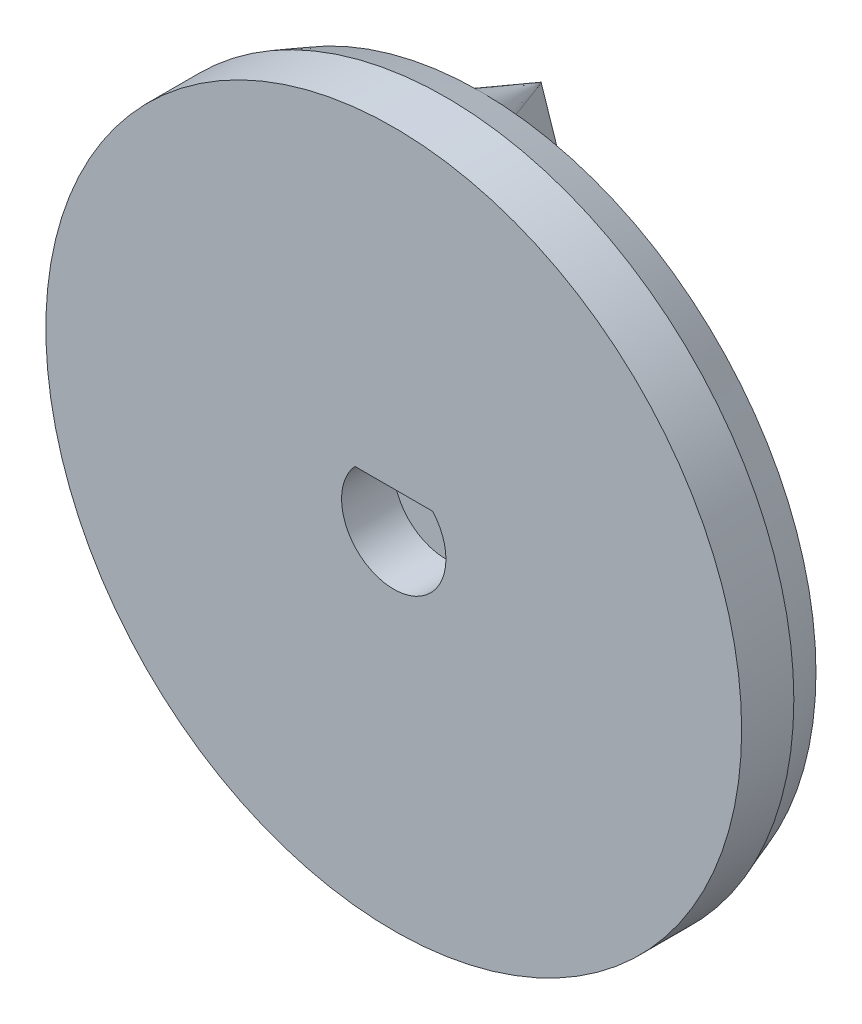
ISO-10303-21;
HEADER;
FILE_DESCRIPTION(('STEP AP214'),'2;1');
FILE_NAME('part.step','',(''),(''),'','','');
FILE_SCHEMA(('AUTOMOTIVE_DESIGN { 1 0 10303 214 1 1 1 1 }'));
ENDSEC;
DATA;
#1=APPLICATION_CONTEXT('core data for automotive mechanical design processes');
#2=APPLICATION_PROTOCOL_DEFINITION('international standard','automotive_design',2000,#1);
#3=PRODUCT_CONTEXT('',#1,'mechanical');
#4=PRODUCT('Part','Part','',(#3));
#5=PRODUCT_RELATED_PRODUCT_CATEGORY('part','',(#4));
#6=PRODUCT_DEFINITION_FORMATION('','',#4);
#7=PRODUCT_DEFINITION_CONTEXT('part definition',#1,'design');
#8=PRODUCT_DEFINITION('design','',#6,#7);
#9=PRODUCT_DEFINITION_SHAPE('','',#8);
#10=(LENGTH_UNIT() NAMED_UNIT(*) SI_UNIT(.MILLI.,.METRE.));
#11=(NAMED_UNIT(*) PLANE_ANGLE_UNIT() SI_UNIT($,.RADIAN.));
#12=(NAMED_UNIT(*) SI_UNIT($,.STERADIAN.) SOLID_ANGLE_UNIT());
#13=UNCERTAINTY_MEASURE_WITH_UNIT(LENGTH_MEASURE(1.E-05),#10,'distance_accuracy_value','');
#14=(GEOMETRIC_REPRESENTATION_CONTEXT(3) GLOBAL_UNCERTAINTY_ASSIGNED_CONTEXT((#13)) GLOBAL_UNIT_ASSIGNED_CONTEXT((#10,
#11,#12)) REPRESENTATION_CONTEXT('',''));
#15=CARTESIAN_POINT('',(0.,0.,0.));
#16=DIRECTION('',(0.,0.,1.));
#17=DIRECTION('',(1.,0.,0.));
#18=AXIS2_PLACEMENT_3D('',#15,#16,#17);
#19=CARTESIAN_POINT('',(0.,0.,-2.));
#20=DIRECTION('',(0.,0.,1.));
#21=DIRECTION('',(1.,0.,0.));
#22=AXIS2_PLACEMENT_3D('',#19,#20,#21);
#23=PLANE('',#22);
#24=CARTESIAN_POINT('',(0.,18.,-2.));
#25=DIRECTION('',(0.,0.,1.));
#26=DIRECTION('',(1.,0.,0.));
#27=AXIS2_PLACEMENT_3D('',#24,#25,#26);
#28=CIRCLE('',#27,1.2720595314676);
#29=CARTESIAN_POINT('',(0.,19.2720595314676,-2.));
#30=VERTEX_POINT('',#29);
#31=CARTESIAN_POINT('',(-1.27172190277635,17.9706937955885,-1.99999999997781));
#32=VERTEX_POINT('',#31);
#33=EDGE_CURVE('E202',#30,#32,#28,.T.);
#34=ORIENTED_EDGE('',*,*,#33,.T.);
#35=DIRECTION('',(-0.0905357460425185,-0.995893206467704,0.));
#36=VECTOR('',#35,1.);
#37=CARTESIAN_POINT('',(-2.88160640972484,0.261964219065894,-2.));
#38=LINE('',#37,#36);
#39=CARTESIAN_POINT('',(-4.27194173697115,-15.0317243806433,-1.99999999999996));
#40=VERTEX_POINT('',#39);
#41=EDGE_CURVE('E207',#32,#40,#38,.T.);
#42=ORIENTED_EDGE('',*,*,#41,.T.);
#43=CARTESIAN_POINT('',(0.,-15.,-2.));
#44=DIRECTION('',(0.,0.,1.));
#45=DIRECTION('',(1.,0.,0.));
#46=AXIS2_PLACEMENT_3D('',#43,#44,#45);
#47=CIRCLE('',#46,4.2720595314676);
#48=CARTESIAN_POINT('',(0.,-19.2720595314676,-2.));
#49=VERTEX_POINT('',#48);
#50=EDGE_CURVE('E214',#40,#49,#47,.T.);
#51=ORIENTED_EDGE('',*,*,#50,.T.);
#52=CARTESIAN_POINT('',(0.,0.,-2.));
#53=DIRECTION('',(0.,0.,1.));
#54=DIRECTION('',(1.,0.,0.));
#55=AXIS2_PLACEMENT_3D('',#52,#53,#54);
#56=CIRCLE('',#55,19.2720595314676);
#57=EDGE_CURVE('E11',#30,#49,#56,.T.);
#58=ORIENTED_EDGE('',*,*,#57,.F.);
#59=EDGE_LOOP('',(#34,#42,#51,#58));
#60=FACE_BOUND('',#59,.T.);
#61=ADVANCED_FACE('F41',(#60),#23,.F.);
#62=CARTESIAN_POINT('',(0.,0.,0.));
#63=DIRECTION('',(0.,0.,1.));
#64=DIRECTION('',(1.,0.,0.));
#65=AXIS2_PLACEMENT_3D('',#62,#63,#64);
#66=CONICAL_SURFACE('',#65,20.,0.349065850398867);
#67=CARTESIAN_POINT('',(0.,0.,0.));
#68=DIRECTION('',(0.,0.,1.));
#69=DIRECTION('',(1.,0.,0.));
#70=AXIS2_PLACEMENT_3D('',#67,#68,#69);
#71=CIRCLE('',#70,20.);
#72=CARTESIAN_POINT('',(20.,0.,0.));
#73=VERTEX_POINT('',#72);
#74=EDGE_CURVE('E215',#73,#73,#71,.T.);
#75=ORIENTED_EDGE('',*,*,#74,.F.);
#76=EDGE_LOOP('',(#75));
#77=FACE_BOUND('',#76,.T.);
#78=ORIENTED_EDGE('',*,*,#57,.T.);
#79=EDGE_CURVE('E50',#49,#30,#56,.T.);
#80=ORIENTED_EDGE('',*,*,#79,.T.);
#81=EDGE_LOOP('',(#78,#80));
#82=FACE_BOUND('',#81,.T.);
#83=ADVANCED_FACE('F43',(#77,#82),#66,.T.);
#84=ORIENTED_EDGE('',*,*,#79,.F.);
#85=CARTESIAN_POINT('',(4.27194173697115,-15.0317243806433,-1.99999999999996));
#86=VERTEX_POINT('',#85);
#87=EDGE_CURVE('E211',#49,#86,#47,.T.);
#88=ORIENTED_EDGE('',*,*,#87,.T.);
#89=DIRECTION('',(-0.0905357460425186,0.995893206467704,0.));
#90=VECTOR('',#89,1.);
#91=CARTESIAN_POINT('',(2.88160640972484,0.261964219065895,-2.));
#92=LINE('',#91,#90);
#93=CARTESIAN_POINT('',(1.27172190276827,17.9706937955882,-2.));
#94=VERTEX_POINT('',#93);
#95=EDGE_CURVE('E146',#86,#94,#92,.T.);
#96=ORIENTED_EDGE('',*,*,#95,.T.);
#97=EDGE_CURVE('E206',#94,#30,#28,.T.);
#98=ORIENTED_EDGE('',*,*,#97,.T.);
#99=EDGE_LOOP('',(#84,#88,#96,#98));
#100=FACE_BOUND('',#99,.T.);
#101=ADVANCED_FACE('F161',(#100),#23,.F.);
#102=CARTESIAN_POINT('',(0.,-15.,0.));
#103=DIRECTION('',(0.,0.,1.));
#104=DIRECTION('',(1.,0.,0.));
#105=AXIS2_PLACEMENT_3D('',#102,#103,#104);
#106=CONICAL_SURFACE('',#105,5.,0.349065850398867);
#107=ORIENTED_EDGE('',*,*,#50,.F.);
#108=CARTESIAN_POINT('',(-1.35557940364719,-15.1131998099234,-10.));
#109=CARTESIAN_POINT('',(-1.47152429195794,-15.1127493254877,-9.68264022531766));
#110=CARTESIAN_POINT('',(-1.58742127746624,-15.1117086108638,-9.36526470524089));
#111=CARTESIAN_POINT('',(-1.81913886773945,-15.1087008475732,-8.73049223674115));
#112=CARTESIAN_POINT('',(-1.93495947296489,-15.1067338045439,-8.41309528846034));
#113=CARTESIAN_POINT('',(-2.2968381613521,-15.0995359334336,-7.4211345236218));
#114=CARTESIAN_POINT('',(-2.542798579936,-15.0931231478979,-6.74654393039555));
#115=CARTESIAN_POINT('',(-3.03455885754886,-15.0783757588888,-5.39732402360426));
#116=CARTESIAN_POINT('',(-3.28035871608836,-15.0700411495836,-4.72269470992793));
#117=CARTESIAN_POINT('',(-3.77184967112229,-15.0520090879505,-3.3733946763651));
#118=CARTESIAN_POINT('',(-4.01754076456712,-15.0423115995711,-2.69872395585534));
#119=CARTESIAN_POINT('',(-4.50883183261875,-15.0218658897777,-1.34937046916008));
#120=CARTESIAN_POINT('',(-4.75443180784455,-15.0111176756379,-0.674687703090297));
#121=CARTESIAN_POINT('',(-5.00000000000206,-15.0000000000249,-5.68905754800977E-13));
#122=B_SPLINE_CURVE_WITH_KNOTS('',3,(#108,#109,#110,#111,#112,#113,#114,#115,#116,#117,#118,
#119,#120,#121),.UNSPECIFIED.,.F.,.F.,(4,2,2,2,2,2,4),(0.,1.01362824345405,2.02725031829099,
4.18142558107841,6.33560738066218,8.48984617418498,10.6440700548492),.UNSPECIFIED.);
#123=CARTESIAN_POINT('',(-1.35557940364719,-15.1131998099234,-10.));
#124=VERTEX_POINT('',#123);
#125=EDGE_CURVE('E136',#124,#40,#122,.T.);
#126=ORIENTED_EDGE('',*,*,#125,.F.);
#127=CARTESIAN_POINT('',(0.,-15.,-10.));
#128=DIRECTION('',(0.,0.,1.));
#129=DIRECTION('',(1.,0.,0.));
#130=AXIS2_PLACEMENT_3D('',#127,#128,#129);
#131=CIRCLE('',#130,1.36029765733797);
#132=CARTESIAN_POINT('',(1.35557940364719,-15.1131998099234,-10.));
#133=VERTEX_POINT('',#132);
#134=EDGE_CURVE('E111',#124,#133,#131,.T.);
#135=ORIENTED_EDGE('',*,*,#134,.T.);
#136=CARTESIAN_POINT('',(1.35557940364719,-15.1131998099234,-10.));
#137=CARTESIAN_POINT('',(1.47152429195794,-15.1127493254877,-9.68264022531766));
#138=CARTESIAN_POINT('',(1.58742127746625,-15.1117086108638,-9.36526470524089));
#139=CARTESIAN_POINT('',(1.81913886773946,-15.1087008475732,-8.73049223674115));
#140=CARTESIAN_POINT('',(1.93495947296489,-15.1067338045439,-8.41309528846034));
#141=CARTESIAN_POINT('',(2.29683816135211,-15.0995359334336,-7.4211345236218));
#142=CARTESIAN_POINT('',(2.542798579936,-15.0931231478979,-6.74654393039555));
#143=CARTESIAN_POINT('',(3.03455885754887,-15.0783757588888,-5.39732402360427));
#144=CARTESIAN_POINT('',(3.28035871608836,-15.0700411495836,-4.72269470992793));
#145=CARTESIAN_POINT('',(3.7718496711223,-15.0520090879505,-3.3733946763651));
#146=CARTESIAN_POINT('',(4.01754076456712,-15.0423115995711,-2.69872395585534));
#147=CARTESIAN_POINT('',(4.50883183261875,-15.0218658897777,-1.34937046916008));
#148=CARTESIAN_POINT('',(4.75443180784456,-15.0111176756379,-0.6746877030903));
#149=CARTESIAN_POINT('',(5.00000000000206,-15.0000000000249,-5.70215291144058E-13));
#150=B_SPLINE_CURVE_WITH_KNOTS('',3,(#136,#137,#138,#139,#140,#141,#142,#143,#144,#145,#146,
#147,#148,#149),.UNSPECIFIED.,.F.,.F.,(4,2,2,2,2,2,4),(0.,1.01362824345405,2.02725031829099,
4.18142558107841,6.33560738066218,8.48984617418498,10.6440700548492),.UNSPECIFIED.);
#151=EDGE_CURVE('E148',#133,#86,#150,.T.);
#152=ORIENTED_EDGE('',*,*,#151,.T.);
#153=ORIENTED_EDGE('',*,*,#87,.F.);
#154=EDGE_LOOP('',(#107,#126,#135,#152,#153));
#155=FACE_BOUND('',#154,.T.);
#156=ADVANCED_FACE('F158',(#155),#106,.T.);
#157=CARTESIAN_POINT('',(-5.,-15.,0.));
#158=DIRECTION('',(-0.935833497208518,0.0850757724735016,-0.342020143325669));
#159=DIRECTION('',(-0.343264654725118,0.,0.939238721953288));
#160=AXIS2_PLACEMENT_3D('',#157,#158,#159);
#161=PLANE('',#160);
#162=ORIENTED_EDGE('',*,*,#41,.F.);
#163=CARTESIAN_POINT('',(0.,17.9924683009297,-5.47426166578347));
#164=CARTESIAN_POINT('',(-0.000658792508696172,17.9918721301336,-5.4726073760658));
#165=CARTESIAN_POINT('',(-0.00131899163214776,17.9913406864215,-5.47093313704391));
#166=CARTESIAN_POINT('',(-0.00263962265345564,17.990369181912,-5.46756129104861));
#167=CARTESIAN_POINT('',(-0.00330005258229472,17.9899289798807,-5.46586372459401));
#168=CARTESIAN_POINT('',(-0.00660119120331832,17.9878573956222,-5.45734646464226));
#169=CARTESIAN_POINT('',(-0.00923977768205241,17.9866136247982,-5.45043616156633));
#170=CARTESIAN_POINT('',(-0.0145127936017149,17.9844201137202,-5.4365537912668));
#171=CARTESIAN_POINT('',(-0.0171471898100953,17.9834712208195,-5.42958160419907));
#172=CARTESIAN_POINT('',(-0.0250221998469685,17.9808932100017,-5.40867531531193));
#173=CARTESIAN_POINT('',(-0.0302525776186212,17.9795245433101,-5.3947044354121));
#174=CARTESIAN_POINT('',(-0.0406972144000417,17.9770995793523,-5.36672907936651));
#175=CARTESIAN_POINT('',(-0.0459114679466594,17.9760433784645,-5.35272459419534));
#176=CARTESIAN_POINT('',(-0.0615432767863536,17.9731694920844,-5.31066779575507));
#177=CARTESIAN_POINT('',(-0.0719437063987493,17.9716481186552,-5.28258863555256));
#178=CARTESIAN_POINT('',(-0.103079585425852,17.9676533722367,-5.1983885000249));
#179=CARTESIAN_POINT('',(-0.123777495013433,17.9657438016001,-5.14222999798324));
#180=CARTESIAN_POINT('',(-0.165116283694516,17.9626022427273,-5.02990049522257));
#181=CARTESIAN_POINT('',(-0.185757182022399,17.9613699881948,-4.97372950811442));
#182=CARTESIAN_POINT('',(-0.247666378160753,17.958286597704,-4.80510090880773));
#183=CARTESIAN_POINT('',(-0.288888753669274,17.9570517306312,-4.69261565518737));
#184=CARTESIAN_POINT('',(-0.412431132476277,17.9545078686936,-4.35521250030029));
#185=CARTESIAN_POINT('',(-0.49466013336963,17.954357657174,-4.13025535780924));
#186=CARTESIAN_POINT('',(-0.659003830598069,17.9554293534376,-3.68031252458136));
#187=CARTESIAN_POINT('',(-0.741118530067599,17.9566512228219,-3.45532683481965));
#188=CARTESIAN_POINT('',(-0.987318725156767,17.9615534475133,-2.78045591086828));
#189=CARTESIAN_POINT('',(-1.15130204729044,17.9664704115592,-2.33054264302856));
#190=CARTESIAN_POINT('',(-1.42939349733308,17.9761667756041,-1.56721853772901));
#191=CARTESIAN_POINT('',(-1.5435365156784,17.9805351651275,-1.25381447003018));
#192=CARTESIAN_POINT('',(-1.77179223247623,17.989866742006,-0.626941342806422));
#193=CARTESIAN_POINT('',(-1.88590492200445,17.9948300343497,-0.313472281584696));
#194=CARTESIAN_POINT('',(-2.,18.,0.));
#195=B_SPLINE_CURVE_WITH_KNOTS('',3,(#163,#164,#165,#166,#167,#168,#169,#170,#171,#172,#173,
#174,#175,#176,#177,#178,#179,#180,#181,#182,#183,#184,#185,#186,#187,#188,#189,#190,#191,#192,
#193,#194),.UNSPECIFIED.,.F.,.F.,(4,2,2,2,2,2,2,2,2,2,2,2,2,2,2,4),(0.,0.00562865848783333,
0.0112485381626291,0.0337254741632951,0.056266414466628,0.101195369903801,0.146138169027114,
0.236076807309796,0.415713944813965,0.595280404839262,0.954694769083883,1.67322992369596,
2.39174496990232,3.82841037446911,4.82912426406011,5.83001502069884),.UNSPECIFIED.);
#196=CARTESIAN_POINT('',(0.,17.9924683009297,-5.47426166578347));
#197=VERTEX_POINT('',#196);
#198=EDGE_CURVE('E147',#197,#32,#195,.T.);
#199=ORIENTED_EDGE('',*,*,#198,.F.);
#200=DIRECTION('',(0.,0.970428403441208,0.241389133546952));
#201=VECTOR('',#200,1.);
#202=CARTESIAN_POINT('',(0.,19.2819117034801,-5.15351917247256));
#203=LINE('',#202,#201);
#204=CARTESIAN_POINT('',(0.,-0.201826369804339,-10.));
#205=VERTEX_POINT('',#204);
#206=EDGE_CURVE('E180',#205,#197,#203,.T.);
#207=ORIENTED_EDGE('',*,*,#206,.F.);
#208=DIRECTION('',(-0.0905357460425185,-0.995893206467704,0.));
#209=VECTOR('',#208,1.);
#210=CARTESIAN_POINT('',(-1.33426155682092,-14.8787034948345,-10.));
#211=LINE('',#210,#209);
#212=EDGE_CURVE('E192',#205,#124,#211,.T.);
#213=ORIENTED_EDGE('',*,*,#212,.T.);
#214=ORIENTED_EDGE('',*,*,#125,.T.);
#215=EDGE_LOOP('',(#162,#199,#207,#213,#214));
#216=FACE_BOUND('',#215,.T.);
#217=ADVANCED_FACE('F155',(#216),#161,.T.);
#218=CARTESIAN_POINT('',(0.,18.,0.));
#219=DIRECTION('',(0.,0.,1.));
#220=DIRECTION('',(1.,0.,0.));
#221=AXIS2_PLACEMENT_3D('',#218,#219,#220);
#222=CONICAL_SURFACE('',#221,2.,0.349065850398867);
#223=CARTESIAN_POINT('',(0.,18.,-5.49495483890924));
#224=VERTEX_POINT('',#223);
#225=VERTEX_LOOP('',#224);
#226=FACE_BOUND('',#225,.T.);
#227=ORIENTED_EDGE('',*,*,#97,.F.);
#228=CARTESIAN_POINT('',(0.,17.9924683009297,-5.47426166578347));
#229=CARTESIAN_POINT('',(0.000658792508696435,17.9918721301336,-5.4726073760658));
#230=CARTESIAN_POINT('',(0.00131899163214815,17.9913406864215,-5.47093313704391));
#231=CARTESIAN_POINT('',(0.00263962265345574,17.990369181912,-5.46756129104861));
#232=CARTESIAN_POINT('',(0.0033000525822944,17.9899289798807,-5.46586372459401));
#233=CARTESIAN_POINT('',(0.00660119120331671,17.9878573956222,-5.45734646464226));
#234=CARTESIAN_POINT('',(0.00923977768205238,17.9866136247982,-5.45043616156633));
#235=CARTESIAN_POINT('',(0.0145127936017156,17.9844201137202,-5.4365537912668));
#236=CARTESIAN_POINT('',(0.0171471898100951,17.9834712208195,-5.42958160419907));
#237=CARTESIAN_POINT('',(0.0250221998469676,17.9808932100017,-5.40867531531193));
#238=CARTESIAN_POINT('',(0.0302525776186212,17.9795245433101,-5.3947044354121));
#239=CARTESIAN_POINT('',(0.0406972144000423,17.9770995793523,-5.36672907936651));
#240=CARTESIAN_POINT('',(0.0459114679466596,17.9760433784645,-5.35272459419534));
#241=CARTESIAN_POINT('',(0.0615432767863528,17.9731694920844,-5.31066779575507));
#242=CARTESIAN_POINT('',(0.0719437063987487,17.9716481186552,-5.28258863555256));
#243=CARTESIAN_POINT('',(0.103079585425852,17.9676533722367,-5.19838850002491));
#244=CARTESIAN_POINT('',(0.123777495013432,17.9657438016001,-5.14222999798324));
#245=CARTESIAN_POINT('',(0.165116283694515,17.9626022427273,-5.02990049522257));
#246=CARTESIAN_POINT('',(0.185757182022398,17.9613699881948,-4.97372950811442));
#247=CARTESIAN_POINT('',(0.247666378160752,17.958286597704,-4.80510090880773));
#248=CARTESIAN_POINT('',(0.288888753669273,17.9570517306312,-4.69261565518737));
#249=CARTESIAN_POINT('',(0.412431132476277,17.9545078686936,-4.35521250030029));
#250=CARTESIAN_POINT('',(0.49466013336963,17.954357657174,-4.13025535780924));
#251=CARTESIAN_POINT('',(0.659003830598069,17.9554293534376,-3.68031252458137));
#252=CARTESIAN_POINT('',(0.741118530067599,17.9566512228219,-3.45532683481965));
#253=CARTESIAN_POINT('',(0.987318725156767,17.9615534475133,-2.78045591086828));
#254=CARTESIAN_POINT('',(1.15130204729044,17.9664704115592,-2.33054264302856));
#255=CARTESIAN_POINT('',(1.42939349733308,17.9761667756041,-1.56721853772901));
#256=CARTESIAN_POINT('',(1.54353651567839,17.9805351651275,-1.25381447003018));
#257=CARTESIAN_POINT('',(1.77179223247623,17.989866742006,-0.626941342806422));
#258=CARTESIAN_POINT('',(1.88590492200445,17.9948300343497,-0.313472281584695));
#259=CARTESIAN_POINT('',(2.,18.,0.));
#260=B_SPLINE_CURVE_WITH_KNOTS('',3,(#228,#229,#230,#231,#232,#233,#234,#235,#236,#237,#238,
#239,#240,#241,#242,#243,#244,#245,#246,#247,#248,#249,#250,#251,#252,#253,#254,#255,#256,#257,
#258,#259),.UNSPECIFIED.,.F.,.F.,(4,2,2,2,2,2,2,2,2,2,2,2,2,2,2,4),(0.,0.00562865848783287,
0.0112485381626292,0.0337254741632972,0.0562664144666271,0.101195369903802,0.146138169027116,
0.236076807309795,0.415713944813962,0.595280404839262,0.954694769083882,1.67322992369596,
2.39174496990231,3.82841037446911,4.82912426406011,5.83001502069884),.UNSPECIFIED.);
#261=EDGE_CURVE('E65',#197,#94,#260,.T.);
#262=ORIENTED_EDGE('',*,*,#261,.F.);
#263=ORIENTED_EDGE('',*,*,#198,.T.);
#264=ORIENTED_EDGE('',*,*,#33,.F.);
#265=EDGE_LOOP('',(#227,#262,#263,#264));
#266=FACE_BOUND('',#265,.T.);
#267=ADVANCED_FACE('F169',(#226,#266),#222,.T.);
#268=CARTESIAN_POINT('',(2.,18.,0.));
#269=DIRECTION('',(0.935833497208518,0.0850757724735017,-0.342020143325669));
#270=DIRECTION('',(-0.343264654725118,0.,-0.939238721953288));
#271=AXIS2_PLACEMENT_3D('',#268,#269,#270);
#272=PLANE('',#271);
#273=ORIENTED_EDGE('',*,*,#95,.F.);
#274=ORIENTED_EDGE('',*,*,#151,.F.);
#275=DIRECTION('',(-0.0905357460425186,0.995893206467704,0.));
#276=VECTOR('',#275,1.);
#277=CARTESIAN_POINT('',(1.33426155682092,-14.8787034948345,-10.));
#278=LINE('',#277,#276);
#279=EDGE_CURVE('E191',#133,#205,#278,.T.);
#280=ORIENTED_EDGE('',*,*,#279,.T.);
#281=ORIENTED_EDGE('',*,*,#206,.T.);
#282=ORIENTED_EDGE('',*,*,#261,.T.);
#283=EDGE_LOOP('',(#273,#274,#280,#281,#282));
#284=FACE_BOUND('',#283,.T.);
#285=ADVANCED_FACE('F163',(#284),#272,.T.);
#286=CARTESIAN_POINT('',(0.,-15.,-10.));
#287=DIRECTION('',(0.,0.,1.));
#288=DIRECTION('',(1.,0.,0.));
#289=AXIS2_PLACEMENT_3D('',#286,#287,#288);
#290=PLANE('',#289);
#291=ORIENTED_EDGE('',*,*,#134,.F.);
#292=ORIENTED_EDGE('',*,*,#212,.F.);
#293=ORIENTED_EDGE('',*,*,#279,.F.);
#294=EDGE_LOOP('',(#291,#292,#293));
#295=FACE_BOUND('',#294,.T.);
#296=ADVANCED_FACE('F168',(#295),#290,.F.);
#297=CARTESIAN_POINT('',(0.,0.,3.));
#298=DIRECTION('',(0.,0.,-1.));
#299=DIRECTION('',(-1.,0.,0.));
#300=AXIS2_PLACEMENT_3D('',#297,#298,#299);
#301=CYLINDRICAL_SURFACE('',#300,3.);
#302=CARTESIAN_POINT('',(0.,0.,0.));
#303=DIRECTION('',(0.,0.,1.));
#304=DIRECTION('',(1.,0.,0.));
#305=AXIS2_PLACEMENT_3D('',#302,#303,#304);
#306=CIRCLE('',#305,3.);
#307=CARTESIAN_POINT('',(-2.23606797749979,2.,0.));
#308=VERTEX_POINT('',#307);
#309=CARTESIAN_POINT('',(2.23606797749979,2.,0.));
#310=VERTEX_POINT('',#309);
#311=EDGE_CURVE('E57',#308,#310,#306,.T.);
#312=ORIENTED_EDGE('',*,*,#311,.F.);
#313=DIRECTION('',(0.,0.,-1.));
#314=VECTOR('',#313,1.);
#315=CARTESIAN_POINT('',(-2.23606797749979,2.,3.));
#316=LINE('',#315,#314);
#317=CARTESIAN_POINT('',(-2.23606797749979,2.,3.));
#318=VERTEX_POINT('',#317);
#319=EDGE_CURVE('E102',#318,#308,#316,.T.);
#320=ORIENTED_EDGE('',*,*,#319,.F.);
#321=CARTESIAN_POINT('',(0.,0.,3.));
#322=DIRECTION('',(0.,0.,1.));
#323=DIRECTION('',(1.,0.,0.));
#324=AXIS2_PLACEMENT_3D('',#321,#322,#323);
#325=CIRCLE('',#324,3.);
#326=CARTESIAN_POINT('',(2.23606797749979,2.,3.));
#327=VERTEX_POINT('',#326);
#328=EDGE_CURVE('E106',#318,#327,#325,.T.);
#329=ORIENTED_EDGE('',*,*,#328,.T.);
#330=DIRECTION('',(0.,0.,-1.));
#331=VECTOR('',#330,1.);
#332=CARTESIAN_POINT('',(2.23606797749979,2.,3.));
#333=LINE('',#332,#331);
#334=EDGE_CURVE('E112',#327,#310,#333,.T.);
#335=ORIENTED_EDGE('',*,*,#334,.T.);
#336=EDGE_LOOP('',(#312,#320,#329,#335));
#337=FACE_BOUND('',#336,.T.);
#338=ADVANCED_FACE('F104',(#337),#301,.F.);
#339=CARTESIAN_POINT('',(0.,2.,3.));
#340=DIRECTION('',(0.,1.,0.));
#341=DIRECTION('',(0.,0.,1.));
#342=AXIS2_PLACEMENT_3D('',#339,#340,#341);
#343=PLANE('',#342);
#344=DIRECTION('',(1.,0.,0.));
#345=VECTOR('',#344,1.);
#346=CARTESIAN_POINT('',(0.,2.,0.));
#347=LINE('',#346,#345);
#348=EDGE_CURVE('E124',#308,#310,#347,.T.);
#349=ORIENTED_EDGE('',*,*,#348,.T.);
#350=ORIENTED_EDGE('',*,*,#334,.F.);
#351=DIRECTION('',(1.,0.,0.));
#352=VECTOR('',#351,1.);
#353=CARTESIAN_POINT('',(0.,2.,3.));
#354=LINE('',#353,#352);
#355=EDGE_CURVE('E115',#318,#327,#354,.T.);
#356=ORIENTED_EDGE('',*,*,#355,.F.);
#357=ORIENTED_EDGE('',*,*,#319,.T.);
#358=EDGE_LOOP('',(#349,#350,#356,#357));
#359=FACE_BOUND('',#358,.T.);
#360=ADVANCED_FACE('F116',(#359),#343,.F.);
#361=CARTESIAN_POINT('',(0.,0.,3.));
#362=DIRECTION('',(0.,0.,-1.));
#363=DIRECTION('',(-1.,0.,0.));
#364=AXIS2_PLACEMENT_3D('',#361,#362,#363);
#365=CYLINDRICAL_SURFACE('',#364,20.);
#366=CARTESIAN_POINT('',(0.,0.,3.));
#367=DIRECTION('',(0.,0.,1.));
#368=DIRECTION('',(1.,0.,0.));
#369=AXIS2_PLACEMENT_3D('',#366,#367,#368);
#370=CIRCLE('',#369,20.);
#371=CARTESIAN_POINT('',(20.,0.,3.));
#372=VERTEX_POINT('',#371);
#373=EDGE_CURVE('E119',#372,#372,#370,.T.);
#374=ORIENTED_EDGE('',*,*,#373,.F.);
#375=EDGE_LOOP('',(#374));
#376=FACE_BOUND('',#375,.T.);
#377=ORIENTED_EDGE('',*,*,#74,.T.);
#378=EDGE_LOOP('',(#377));
#379=FACE_BOUND('',#378,.T.);
#380=ADVANCED_FACE('F245',(#376,#379),#365,.T.);
#381=CARTESIAN_POINT('',(0.,0.,3.));
#382=DIRECTION('',(0.,0.,1.));
#383=DIRECTION('',(1.,0.,0.));
#384=AXIS2_PLACEMENT_3D('',#381,#382,#383);
#385=PLANE('',#384);
#386=ORIENTED_EDGE('',*,*,#328,.F.);
#387=ORIENTED_EDGE('',*,*,#355,.T.);
#388=EDGE_LOOP('',(#386,#387));
#389=FACE_BOUND('',#388,.T.);
#390=ORIENTED_EDGE('',*,*,#373,.T.);
#391=EDGE_LOOP('',(#390));
#392=FACE_BOUND('',#391,.T.);
#393=ADVANCED_FACE('F121',(#389,#392),#385,.T.);
#394=CARTESIAN_POINT('',(0.,0.,0.));
#395=DIRECTION('',(0.,0.,1.));
#396=DIRECTION('',(1.,0.,0.));
#397=AXIS2_PLACEMENT_3D('',#394,#395,#396);
#398=PLANE('',#397);
#399=ORIENTED_EDGE('',*,*,#311,.T.);
#400=ORIENTED_EDGE('',*,*,#348,.F.);
#401=EDGE_LOOP('',(#399,#400));
#402=FACE_BOUND('',#401,.T.);
#403=ADVANCED_FACE('F238',(#402),#398,.T.);
#404=CLOSED_SHELL('',(#61,#83,#101,#156,#217,#267,#285,#296,#338,#360,#380,#393,#403));
#405=MANIFOLD_SOLID_BREP('B2',#404);
#406=ADVANCED_BREP_SHAPE_REPRESENTATION('',(#18,#405),#14);
#407=SHAPE_DEFINITION_REPRESENTATION(#9,#406);
ENDSEC;
END-ISO-10303-21;
